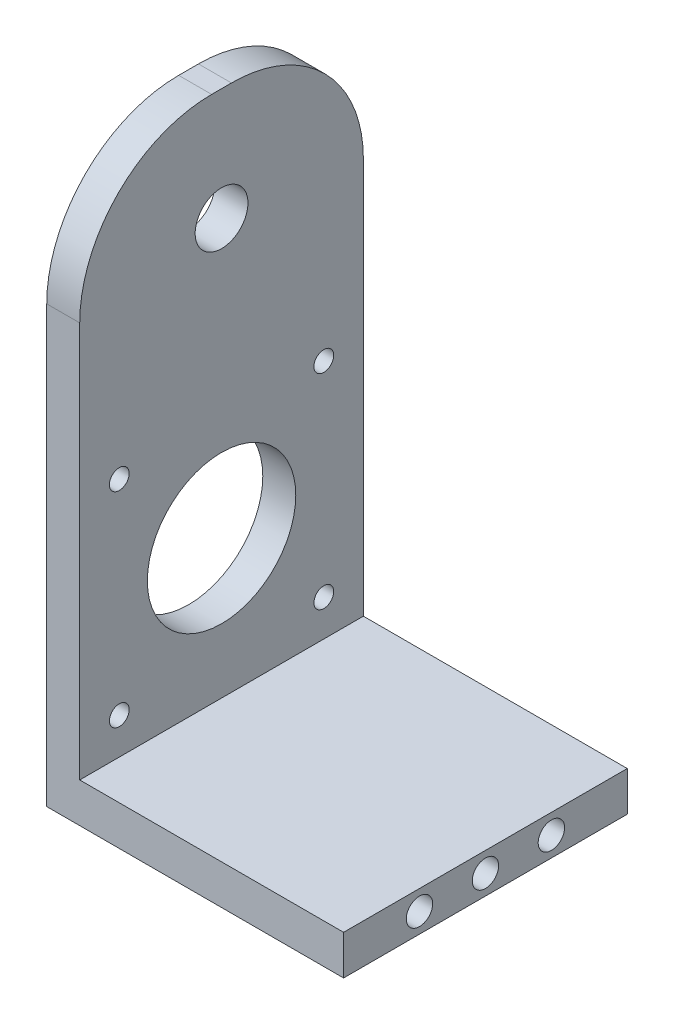
ISO-10303-21;
HEADER;
FILE_DESCRIPTION(('STEP AP214'),'2;1');
FILE_NAME('part.step','',(''),(''),'','','');
FILE_SCHEMA(('AUTOMOTIVE_DESIGN { 1 0 10303 214 1 1 1 1 }'));
ENDSEC;
DATA;
#1=APPLICATION_CONTEXT('core data for automotive mechanical design processes');
#2=APPLICATION_PROTOCOL_DEFINITION('international standard','automotive_design',2000,#1);
#3=PRODUCT_CONTEXT('',#1,'mechanical');
#4=PRODUCT('Part','Part','',(#3));
#5=PRODUCT_RELATED_PRODUCT_CATEGORY('part','',(#4));
#6=PRODUCT_DEFINITION_FORMATION('','',#4);
#7=PRODUCT_DEFINITION_CONTEXT('part definition',#1,'design');
#8=PRODUCT_DEFINITION('design','',#6,#7);
#9=PRODUCT_DEFINITION_SHAPE('','',#8);
#10=(LENGTH_UNIT() NAMED_UNIT(*) SI_UNIT(.MILLI.,.METRE.));
#11=(NAMED_UNIT(*) PLANE_ANGLE_UNIT() SI_UNIT($,.RADIAN.));
#12=(NAMED_UNIT(*) SI_UNIT($,.STERADIAN.) SOLID_ANGLE_UNIT());
#13=UNCERTAINTY_MEASURE_WITH_UNIT(LENGTH_MEASURE(1.E-05),#10,'distance_accuracy_value','');
#14=(GEOMETRIC_REPRESENTATION_CONTEXT(3) GLOBAL_UNCERTAINTY_ASSIGNED_CONTEXT((#13)) GLOBAL_UNIT_ASSIGNED_CONTEXT((#10,
#11,#12)) REPRESENTATION_CONTEXT('',''));
#15=CARTESIAN_POINT('',(0.,0.,0.));
#16=DIRECTION('',(0.,0.,1.));
#17=DIRECTION('',(1.,0.,0.));
#18=AXIS2_PLACEMENT_3D('',#15,#16,#17);
#19=CARTESIAN_POINT('',(-22.5,6.,21.5));
#20=DIRECTION('',(1.,0.,0.));
#21=DIRECTION('',(0.,0.,-1.));
#22=AXIS2_PLACEMENT_3D('',#19,#20,#21);
#23=PLANE('',#22);
#24=CARTESIAN_POINT('',(-22.5,69.,0.));
#25=DIRECTION('',(1.,0.,0.));
#26=DIRECTION('',(0.,0.,-1.));
#27=AXIS2_PLACEMENT_3D('',#24,#25,#26);
#28=CIRCLE('',#27,4.);
#29=CARTESIAN_POINT('',(-22.5,69.,-4.));
#30=VERTEX_POINT('',#29);
#31=EDGE_CURVE('E286',#30,#30,#28,.F.);
#32=ORIENTED_EDGE('',*,*,#31,.F.);
#33=EDGE_LOOP('',(#32));
#34=FACE_BOUND('',#33,.T.);
#35=CARTESIAN_POINT('',(-22.5,11.5000000000002,15.4999999999993));
#36=DIRECTION('',(1.,0.,0.));
#37=DIRECTION('',(0.,0.,-1.));
#38=AXIS2_PLACEMENT_3D('',#35,#36,#37);
#39=CIRCLE('',#38,1.5);
#40=CARTESIAN_POINT('',(-22.5,11.5000000000002,13.9999999999993));
#41=VERTEX_POINT('',#40);
#42=EDGE_CURVE('E306',#41,#41,#39,.F.);
#43=ORIENTED_EDGE('',*,*,#42,.F.);
#44=EDGE_LOOP('',(#43));
#45=FACE_BOUND('',#44,.T.);
#46=CARTESIAN_POINT('',(-22.5,11.5000000000008,-15.5000000000008));
#47=DIRECTION('',(1.,0.,0.));
#48=DIRECTION('',(0.,0.,-1.));
#49=AXIS2_PLACEMENT_3D('',#46,#47,#48);
#50=CIRCLE('',#49,1.5);
#51=CARTESIAN_POINT('',(-22.5,11.5000000000008,-17.0000000000008));
#52=VERTEX_POINT('',#51);
#53=EDGE_CURVE('E300',#52,#52,#50,.F.);
#54=ORIENTED_EDGE('',*,*,#53,.F.);
#55=EDGE_LOOP('',(#54));
#56=FACE_BOUND('',#55,.T.);
#57=CARTESIAN_POINT('',(-22.5,42.5000000000008,-15.5000000000001));
#58=DIRECTION('',(1.,0.,0.));
#59=DIRECTION('',(0.,0.,-1.));
#60=AXIS2_PLACEMENT_3D('',#57,#58,#59);
#61=CIRCLE('',#60,1.5);
#62=CARTESIAN_POINT('',(-22.5,42.5000000000008,-17.));
#63=VERTEX_POINT('',#62);
#64=EDGE_CURVE('E294',#63,#63,#61,.F.);
#65=ORIENTED_EDGE('',*,*,#64,.F.);
#66=EDGE_LOOP('',(#65));
#67=FACE_BOUND('',#66,.T.);
#68=CARTESIAN_POINT('',(-22.5,42.5,15.5));
#69=DIRECTION('',(1.,0.,0.));
#70=DIRECTION('',(0.,0.,-1.));
#71=AXIS2_PLACEMENT_3D('',#68,#69,#70);
#72=CIRCLE('',#71,1.5);
#73=CARTESIAN_POINT('',(-22.5,42.5,14.));
#74=VERTEX_POINT('',#73);
#75=EDGE_CURVE('E293',#74,#74,#72,.F.);
#76=ORIENTED_EDGE('',*,*,#75,.F.);
#77=EDGE_LOOP('',(#76));
#78=FACE_BOUND('',#77,.T.);
#79=CARTESIAN_POINT('',(-22.5,27.,0.));
#80=DIRECTION('',(1.,0.,0.));
#81=DIRECTION('',(0.,0.,-1.));
#82=AXIS2_PLACEMENT_3D('',#79,#80,#81);
#83=CIRCLE('',#82,11.25);
#84=CARTESIAN_POINT('',(-22.5,27.,-11.25));
#85=VERTEX_POINT('',#84);
#86=EDGE_CURVE('E125',#85,#85,#83,.F.);
#87=ORIENTED_EDGE('',*,*,#86,.F.);
#88=EDGE_LOOP('',(#87));
#89=FACE_BOUND('',#88,.T.);
#90=DIRECTION('',(0.,-1.,0.));
#91=VECTOR('',#90,1.);
#92=CARTESIAN_POINT('',(-22.5,6.,21.5));
#93=LINE('',#92,#91);
#94=CARTESIAN_POINT('',(-22.5,66.,21.5));
#95=VERTEX_POINT('',#94);
#96=CARTESIAN_POINT('',(-22.5,0.,21.5));
#97=VERTEX_POINT('',#96);
#98=EDGE_CURVE('E154',#95,#97,#93,.T.);
#99=ORIENTED_EDGE('',*,*,#98,.F.);
#100=CARTESIAN_POINT('',(-22.5,66.,1.5));
#101=DIRECTION('',(1.,0.,0.));
#102=DIRECTION('',(0.,0.,-1.));
#103=AXIS2_PLACEMENT_3D('',#100,#101,#102);
#104=CIRCLE('',#103,20.);
#105=CARTESIAN_POINT('',(-22.5,86.,1.5));
#106=VERTEX_POINT('',#105);
#107=EDGE_CURVE('E43',#95,#106,#104,.F.);
#108=ORIENTED_EDGE('',*,*,#107,.T.);
#109=DIRECTION('',(0.,0.,1.));
#110=VECTOR('',#109,1.);
#111=CARTESIAN_POINT('',(-22.5,86.,-21.5));
#112=LINE('',#111,#110);
#113=CARTESIAN_POINT('',(-22.5,86.,-1.49999999999999));
#114=VERTEX_POINT('',#113);
#115=EDGE_CURVE('E124',#114,#106,#112,.T.);
#116=ORIENTED_EDGE('',*,*,#115,.F.);
#117=CARTESIAN_POINT('',(-22.5,66.,-1.49999999999999));
#118=DIRECTION('',(1.,0.,0.));
#119=DIRECTION('',(0.,0.,-1.));
#120=AXIS2_PLACEMENT_3D('',#117,#118,#119);
#121=CIRCLE('',#120,20.);
#122=CARTESIAN_POINT('',(-22.5,66.,-21.5));
#123=VERTEX_POINT('',#122);
#124=EDGE_CURVE('E50',#114,#123,#121,.F.);
#125=ORIENTED_EDGE('',*,*,#124,.T.);
#126=DIRECTION('',(0.,-1.,0.));
#127=VECTOR('',#126,1.);
#128=CARTESIAN_POINT('',(-22.5,6.,-21.5));
#129=LINE('',#128,#127);
#130=CARTESIAN_POINT('',(-22.5,0.,-21.5));
#131=VERTEX_POINT('',#130);
#132=EDGE_CURVE('E120',#123,#131,#129,.T.);
#133=ORIENTED_EDGE('',*,*,#132,.T.);
#134=DIRECTION('',(0.,0.,1.));
#135=VECTOR('',#134,1.);
#136=CARTESIAN_POINT('',(-22.5,0.,21.5));
#137=LINE('',#136,#135);
#138=EDGE_CURVE('E135',#131,#97,#137,.T.);
#139=ORIENTED_EDGE('',*,*,#138,.T.);
#140=EDGE_LOOP('',(#99,#108,#116,#125,#133,#139));
#141=FACE_BOUND('',#140,.T.);
#142=ADVANCED_FACE('F35',(#34,#45,#56,#67,#78,#89,#141),#23,.F.);
#143=CARTESIAN_POINT('',(22.5,6.,21.5));
#144=DIRECTION('',(0.,0.,-1.));
#145=DIRECTION('',(-1.,0.,0.));
#146=AXIS2_PLACEMENT_3D('',#143,#144,#145);
#147=PLANE('',#146);
#148=DIRECTION('',(0.,-1.,0.));
#149=VECTOR('',#148,1.);
#150=CARTESIAN_POINT('',(-17.5,86.,21.5));
#151=LINE('',#150,#149);
#152=CARTESIAN_POINT('',(-17.5,66.,21.5));
#153=VERTEX_POINT('',#152);
#154=CARTESIAN_POINT('',(-17.5,6.,21.5));
#155=VERTEX_POINT('',#154);
#156=EDGE_CURVE('E109',#153,#155,#151,.T.);
#157=ORIENTED_EDGE('',*,*,#156,.F.);
#158=DIRECTION('',(1.,0.,0.));
#159=VECTOR('',#158,1.);
#160=CARTESIAN_POINT('',(22.5,66.,21.5));
#161=LINE('',#160,#159);
#162=EDGE_CURVE('E58',#153,#95,#161,.F.);
#163=ORIENTED_EDGE('',*,*,#162,.T.);
#164=ORIENTED_EDGE('',*,*,#98,.T.);
#165=DIRECTION('',(1.,0.,0.));
#166=VECTOR('',#165,1.);
#167=CARTESIAN_POINT('',(22.5,0.,21.5));
#168=LINE('',#167,#166);
#169=CARTESIAN_POINT('',(22.5,0.,21.5));
#170=VERTEX_POINT('',#169);
#171=EDGE_CURVE('E142',#97,#170,#168,.T.);
#172=ORIENTED_EDGE('',*,*,#171,.T.);
#173=DIRECTION('',(0.,-1.,0.));
#174=VECTOR('',#173,1.);
#175=CARTESIAN_POINT('',(22.5,6.,21.5));
#176=LINE('',#175,#174);
#177=CARTESIAN_POINT('',(22.5,6.,21.5));
#178=VERTEX_POINT('',#177);
#179=EDGE_CURVE('E151',#178,#170,#176,.T.);
#180=ORIENTED_EDGE('',*,*,#179,.F.);
#181=DIRECTION('',(1.,0.,0.));
#182=VECTOR('',#181,1.);
#183=CARTESIAN_POINT('',(22.5,6.,21.5));
#184=LINE('',#183,#182);
#185=EDGE_CURVE('E136',#155,#178,#184,.T.);
#186=ORIENTED_EDGE('',*,*,#185,.F.);
#187=EDGE_LOOP('',(#157,#163,#164,#172,#180,#186));
#188=FACE_BOUND('',#187,.T.);
#189=ADVANCED_FACE('F175',(#188),#147,.F.);
#190=CARTESIAN_POINT('',(22.5,6.,21.5));
#191=DIRECTION('',(-1.,0.,0.));
#192=DIRECTION('',(0.,0.,1.));
#193=AXIS2_PLACEMENT_3D('',#190,#191,#192);
#194=PLANE('',#193);
#195=CARTESIAN_POINT('',(22.5,2.99999999999993,10.));
#196=DIRECTION('',(1.,0.,0.));
#197=DIRECTION('',(0.,0.,-1.));
#198=AXIS2_PLACEMENT_3D('',#195,#196,#197);
#199=CIRCLE('',#198,2.);
#200=CARTESIAN_POINT('',(22.5,2.99999999999993,8.));
#201=VERTEX_POINT('',#200);
#202=EDGE_CURVE('E278',#201,#201,#199,.T.);
#203=ORIENTED_EDGE('',*,*,#202,.F.);
#204=EDGE_LOOP('',(#203));
#205=FACE_BOUND('',#204,.T.);
#206=CARTESIAN_POINT('',(22.5,3.,-10.));
#207=DIRECTION('',(1.,0.,0.));
#208=DIRECTION('',(0.,0.,-1.));
#209=AXIS2_PLACEMENT_3D('',#206,#207,#208);
#210=CIRCLE('',#209,2.);
#211=CARTESIAN_POINT('',(22.5,3.,-12.));
#212=VERTEX_POINT('',#211);
#213=EDGE_CURVE('E267',#212,#212,#210,.T.);
#214=ORIENTED_EDGE('',*,*,#213,.F.);
#215=EDGE_LOOP('',(#214));
#216=FACE_BOUND('',#215,.T.);
#217=CARTESIAN_POINT('',(22.5,3.,0.));
#218=DIRECTION('',(1.,0.,0.));
#219=DIRECTION('',(0.,0.,-1.));
#220=AXIS2_PLACEMENT_3D('',#217,#218,#219);
#221=CIRCLE('',#220,2.);
#222=CARTESIAN_POINT('',(22.5,3.,-2.));
#223=VERTEX_POINT('',#222);
#224=EDGE_CURVE('E266',#223,#223,#221,.T.);
#225=ORIENTED_EDGE('',*,*,#224,.F.);
#226=EDGE_LOOP('',(#225));
#227=FACE_BOUND('',#226,.T.);
#228=DIRECTION('',(0.,0.,-1.));
#229=VECTOR('',#228,1.);
#230=CARTESIAN_POINT('',(22.5,0.,21.5));
#231=LINE('',#230,#229);
#232=CARTESIAN_POINT('',(22.5,0.,-21.5));
#233=VERTEX_POINT('',#232);
#234=EDGE_CURVE('E144',#170,#233,#231,.T.);
#235=ORIENTED_EDGE('',*,*,#234,.T.);
#236=DIRECTION('',(0.,-1.,0.));
#237=VECTOR('',#236,1.);
#238=CARTESIAN_POINT('',(22.5,6.,-21.5));
#239=LINE('',#238,#237);
#240=CARTESIAN_POINT('',(22.5,6.,-21.5));
#241=VERTEX_POINT('',#240);
#242=EDGE_CURVE('E149',#241,#233,#239,.T.);
#243=ORIENTED_EDGE('',*,*,#242,.F.);
#244=DIRECTION('',(0.,0.,-1.));
#245=VECTOR('',#244,1.);
#246=CARTESIAN_POINT('',(22.5,6.,21.5));
#247=LINE('',#246,#245);
#248=EDGE_CURVE('E118',#178,#241,#247,.T.);
#249=ORIENTED_EDGE('',*,*,#248,.F.);
#250=ORIENTED_EDGE('',*,*,#179,.T.);
#251=EDGE_LOOP('',(#235,#243,#249,#250));
#252=FACE_BOUND('',#251,.T.);
#253=ADVANCED_FACE('F180',(#205,#216,#227,#252),#194,.F.);
#254=CARTESIAN_POINT('',(22.5,6.,-21.5));
#255=DIRECTION('',(0.,0.,1.));
#256=DIRECTION('',(1.,0.,0.));
#257=AXIS2_PLACEMENT_3D('',#254,#255,#256);
#258=PLANE('',#257);
#259=ORIENTED_EDGE('',*,*,#132,.F.);
#260=DIRECTION('',(-1.,0.,0.));
#261=VECTOR('',#260,1.);
#262=CARTESIAN_POINT('',(22.5,66.,-21.5));
#263=LINE('',#262,#261);
#264=CARTESIAN_POINT('',(-17.5,66.,-21.5));
#265=VERTEX_POINT('',#264);
#266=EDGE_CURVE('E11',#123,#265,#263,.F.);
#267=ORIENTED_EDGE('',*,*,#266,.T.);
#268=DIRECTION('',(0.,-1.,0.));
#269=VECTOR('',#268,1.);
#270=CARTESIAN_POINT('',(-17.5,86.,-21.5));
#271=LINE('',#270,#269);
#272=CARTESIAN_POINT('',(-17.5,6.,-21.5));
#273=VERTEX_POINT('',#272);
#274=EDGE_CURVE('E100',#265,#273,#271,.T.);
#275=ORIENTED_EDGE('',*,*,#274,.T.);
#276=DIRECTION('',(-1.,0.,0.));
#277=VECTOR('',#276,1.);
#278=CARTESIAN_POINT('',(22.5,6.,-21.5));
#279=LINE('',#278,#277);
#280=EDGE_CURVE('E104',#241,#273,#279,.T.);
#281=ORIENTED_EDGE('',*,*,#280,.F.);
#282=ORIENTED_EDGE('',*,*,#242,.T.);
#283=DIRECTION('',(-1.,0.,0.));
#284=VECTOR('',#283,1.);
#285=CARTESIAN_POINT('',(22.5,0.,-21.5));
#286=LINE('',#285,#284);
#287=EDGE_CURVE('E138',#233,#131,#286,.T.);
#288=ORIENTED_EDGE('',*,*,#287,.T.);
#289=EDGE_LOOP('',(#259,#267,#275,#281,#282,#288));
#290=FACE_BOUND('',#289,.T.);
#291=ADVANCED_FACE('F102',(#290),#258,.F.);
#292=CARTESIAN_POINT('',(0.,6.,0.));
#293=DIRECTION('',(0.,1.,0.));
#294=DIRECTION('',(0.,0.,1.));
#295=AXIS2_PLACEMENT_3D('',#292,#293,#294);
#296=PLANE('',#295);
#297=DIRECTION('',(0.,0.,-1.));
#298=VECTOR('',#297,1.);
#299=CARTESIAN_POINT('',(-17.5,6.,-21.5));
#300=LINE('',#299,#298);
#301=EDGE_CURVE('E115',#155,#273,#300,.T.);
#302=ORIENTED_EDGE('',*,*,#301,.F.);
#303=ORIENTED_EDGE('',*,*,#185,.T.);
#304=ORIENTED_EDGE('',*,*,#248,.T.);
#305=ORIENTED_EDGE('',*,*,#280,.T.);
#306=EDGE_LOOP('',(#302,#303,#304,#305));
#307=FACE_BOUND('',#306,.T.);
#308=ADVANCED_FACE('F114',(#307),#296,.T.);
#309=CARTESIAN_POINT('',(0.,0.,0.));
#310=DIRECTION('',(0.,1.,0.));
#311=DIRECTION('',(0.,0.,1.));
#312=AXIS2_PLACEMENT_3D('',#309,#310,#311);
#313=PLANE('',#312);
#314=ORIENTED_EDGE('',*,*,#138,.F.);
#315=ORIENTED_EDGE('',*,*,#287,.F.);
#316=ORIENTED_EDGE('',*,*,#234,.F.);
#317=ORIENTED_EDGE('',*,*,#171,.F.);
#318=EDGE_LOOP('',(#314,#315,#316,#317));
#319=FACE_BOUND('',#318,.T.);
#320=ADVANCED_FACE('F184',(#319),#313,.F.);
#321=CARTESIAN_POINT('',(-17.5,86.,-21.5));
#322=DIRECTION('',(-1.,0.,0.));
#323=DIRECTION('',(0.,0.,1.));
#324=AXIS2_PLACEMENT_3D('',#321,#322,#323);
#325=PLANE('',#324);
#326=CARTESIAN_POINT('',(-17.5,69.,0.));
#327=DIRECTION('',(1.,0.,0.));
#328=DIRECTION('',(0.,0.,-1.));
#329=AXIS2_PLACEMENT_3D('',#326,#327,#328);
#330=CIRCLE('',#329,4.);
#331=CARTESIAN_POINT('',(-17.5,69.,-4.));
#332=VERTEX_POINT('',#331);
#333=EDGE_CURVE('E282',#332,#332,#330,.T.);
#334=ORIENTED_EDGE('',*,*,#333,.F.);
#335=EDGE_LOOP('',(#334));
#336=FACE_BOUND('',#335,.T.);
#337=CARTESIAN_POINT('',(-17.5,11.5000000000002,15.4999999999993));
#338=DIRECTION('',(1.,0.,0.));
#339=DIRECTION('',(0.,0.,-1.));
#340=AXIS2_PLACEMENT_3D('',#337,#338,#339);
#341=CIRCLE('',#340,1.5);
#342=CARTESIAN_POINT('',(-17.5,11.5000000000002,13.9999999999993));
#343=VERTEX_POINT('',#342);
#344=EDGE_CURVE('E289',#343,#343,#341,.T.);
#345=ORIENTED_EDGE('',*,*,#344,.F.);
#346=EDGE_LOOP('',(#345));
#347=FACE_BOUND('',#346,.T.);
#348=CARTESIAN_POINT('',(-17.5,11.5000000000008,-15.5000000000008));
#349=DIRECTION('',(1.,0.,0.));
#350=DIRECTION('',(0.,0.,-1.));
#351=AXIS2_PLACEMENT_3D('',#348,#349,#350);
#352=CIRCLE('',#351,1.5);
#353=CARTESIAN_POINT('',(-17.5,11.5000000000008,-17.0000000000008));
#354=VERTEX_POINT('',#353);
#355=EDGE_CURVE('E303',#354,#354,#352,.T.);
#356=ORIENTED_EDGE('',*,*,#355,.F.);
#357=EDGE_LOOP('',(#356));
#358=FACE_BOUND('',#357,.T.);
#359=CARTESIAN_POINT('',(-17.5,42.5000000000008,-15.5000000000001));
#360=DIRECTION('',(1.,0.,0.));
#361=DIRECTION('',(0.,0.,-1.));
#362=AXIS2_PLACEMENT_3D('',#359,#360,#361);
#363=CIRCLE('',#362,1.5);
#364=CARTESIAN_POINT('',(-17.5,42.5000000000008,-17.));
#365=VERTEX_POINT('',#364);
#366=EDGE_CURVE('E297',#365,#365,#363,.T.);
#367=ORIENTED_EDGE('',*,*,#366,.F.);
#368=EDGE_LOOP('',(#367));
#369=FACE_BOUND('',#368,.T.);
#370=CARTESIAN_POINT('',(-17.5,42.5,15.5));
#371=DIRECTION('',(1.,0.,0.));
#372=DIRECTION('',(0.,0.,-1.));
#373=AXIS2_PLACEMENT_3D('',#370,#371,#372);
#374=CIRCLE('',#373,1.5);
#375=CARTESIAN_POINT('',(-17.5,42.5,14.));
#376=VERTEX_POINT('',#375);
#377=EDGE_CURVE('E290',#376,#376,#374,.T.);
#378=ORIENTED_EDGE('',*,*,#377,.F.);
#379=EDGE_LOOP('',(#378));
#380=FACE_BOUND('',#379,.T.);
#381=CARTESIAN_POINT('',(-17.5,27.,0.));
#382=DIRECTION('',(1.,0.,0.));
#383=DIRECTION('',(0.,0.,-1.));
#384=AXIS2_PLACEMENT_3D('',#381,#382,#383);
#385=CIRCLE('',#384,11.25);
#386=CARTESIAN_POINT('',(-17.5,27.,-11.25));
#387=VERTEX_POINT('',#386);
#388=EDGE_CURVE('E130',#387,#387,#385,.T.);
#389=ORIENTED_EDGE('',*,*,#388,.F.);
#390=EDGE_LOOP('',(#389));
#391=FACE_BOUND('',#390,.T.);
#392=DIRECTION('',(0.,0.,-1.));
#393=VECTOR('',#392,1.);
#394=CARTESIAN_POINT('',(-17.5,86.,-21.5));
#395=LINE('',#394,#393);
#396=CARTESIAN_POINT('',(-17.5,86.,1.5));
#397=VERTEX_POINT('',#396);
#398=CARTESIAN_POINT('',(-17.5,86.,-1.49999999999999));
#399=VERTEX_POINT('',#398);
#400=EDGE_CURVE('E110',#397,#399,#395,.T.);
#401=ORIENTED_EDGE('',*,*,#400,.F.);
#402=CARTESIAN_POINT('',(-17.5,66.,1.5));
#403=DIRECTION('',(-1.,0.,0.));
#404=DIRECTION('',(0.,0.,1.));
#405=AXIS2_PLACEMENT_3D('',#402,#403,#404);
#406=CIRCLE('',#405,20.);
#407=EDGE_CURVE('E164',#397,#153,#406,.F.);
#408=ORIENTED_EDGE('',*,*,#407,.T.);
#409=ORIENTED_EDGE('',*,*,#156,.T.);
#410=ORIENTED_EDGE('',*,*,#301,.T.);
#411=ORIENTED_EDGE('',*,*,#274,.F.);
#412=CARTESIAN_POINT('',(-17.5,66.,-1.49999999999999));
#413=DIRECTION('',(-1.,0.,0.));
#414=DIRECTION('',(0.,0.,1.));
#415=AXIS2_PLACEMENT_3D('',#412,#413,#414);
#416=CIRCLE('',#415,20.);
#417=EDGE_CURVE('E162',#265,#399,#416,.F.);
#418=ORIENTED_EDGE('',*,*,#417,.T.);
#419=EDGE_LOOP('',(#401,#408,#409,#410,#411,#418));
#420=FACE_BOUND('',#419,.T.);
#421=ADVANCED_FACE('F123',(#336,#347,#358,#369,#380,#391,#420),#325,.F.);
#422=CARTESIAN_POINT('',(0.,86.,0.));
#423=DIRECTION('',(0.,-1.,0.));
#424=DIRECTION('',(0.,0.,-1.));
#425=AXIS2_PLACEMENT_3D('',#422,#423,#424);
#426=PLANE('',#425);
#427=ORIENTED_EDGE('',*,*,#115,.T.);
#428=DIRECTION('',(1.,0.,0.));
#429=VECTOR('',#428,1.);
#430=CARTESIAN_POINT('',(0.,86.,1.5));
#431=LINE('',#430,#429);
#432=EDGE_CURVE('E159',#106,#397,#431,.T.);
#433=ORIENTED_EDGE('',*,*,#432,.T.);
#434=ORIENTED_EDGE('',*,*,#400,.T.);
#435=DIRECTION('',(-1.,0.,0.));
#436=VECTOR('',#435,1.);
#437=CARTESIAN_POINT('',(0.,86.,-1.49999999999999));
#438=LINE('',#437,#436);
#439=EDGE_CURVE('E156',#399,#114,#438,.T.);
#440=ORIENTED_EDGE('',*,*,#439,.T.);
#441=EDGE_LOOP('',(#427,#433,#434,#440));
#442=FACE_BOUND('',#441,.T.);
#443=ADVANCED_FACE('F171',(#442),#426,.F.);
#444=CARTESIAN_POINT('',(-22.501,27.,0.));
#445=DIRECTION('',(1.,0.,0.));
#446=DIRECTION('',(0.,0.,-1.));
#447=AXIS2_PLACEMENT_3D('',#444,#445,#446);
#448=CYLINDRICAL_SURFACE('',#447,11.25);
#449=ORIENTED_EDGE('',*,*,#388,.T.);
#450=EDGE_LOOP('',(#449));
#451=FACE_BOUND('',#450,.T.);
#452=ORIENTED_EDGE('',*,*,#86,.T.);
#453=EDGE_LOOP('',(#452));
#454=FACE_BOUND('',#453,.T.);
#455=ADVANCED_FACE('F220',(#451,#454),#448,.F.);
#456=CARTESIAN_POINT('',(-22.501,42.5,15.5));
#457=DIRECTION('',(1.,0.,0.));
#458=DIRECTION('',(0.,0.,-1.));
#459=AXIS2_PLACEMENT_3D('',#456,#457,#458);
#460=CYLINDRICAL_SURFACE('',#459,1.5);
#461=ORIENTED_EDGE('',*,*,#377,.T.);
#462=EDGE_LOOP('',(#461));
#463=FACE_BOUND('',#462,.T.);
#464=ORIENTED_EDGE('',*,*,#75,.T.);
#465=EDGE_LOOP('',(#464));
#466=FACE_BOUND('',#465,.T.);
#467=ADVANCED_FACE('F223',(#463,#466),#460,.F.);
#468=CARTESIAN_POINT('',(-22.501,42.5000000000008,-15.5000000000001));
#469=DIRECTION('',(1.,0.,0.));
#470=DIRECTION('',(0.,0.,-1.));
#471=AXIS2_PLACEMENT_3D('',#468,#469,#470);
#472=CYLINDRICAL_SURFACE('',#471,1.5);
#473=ORIENTED_EDGE('',*,*,#366,.T.);
#474=EDGE_LOOP('',(#473));
#475=FACE_BOUND('',#474,.T.);
#476=ORIENTED_EDGE('',*,*,#64,.T.);
#477=EDGE_LOOP('',(#476));
#478=FACE_BOUND('',#477,.T.);
#479=ADVANCED_FACE('F232',(#475,#478),#472,.F.);
#480=CARTESIAN_POINT('',(-22.501,11.5000000000008,-15.5000000000008));
#481=DIRECTION('',(1.,0.,0.));
#482=DIRECTION('',(0.,0.,-1.));
#483=AXIS2_PLACEMENT_3D('',#480,#481,#482);
#484=CYLINDRICAL_SURFACE('',#483,1.5);
#485=ORIENTED_EDGE('',*,*,#355,.T.);
#486=EDGE_LOOP('',(#485));
#487=FACE_BOUND('',#486,.T.);
#488=ORIENTED_EDGE('',*,*,#53,.T.);
#489=EDGE_LOOP('',(#488));
#490=FACE_BOUND('',#489,.T.);
#491=ADVANCED_FACE('F228',(#487,#490),#484,.F.);
#492=CARTESIAN_POINT('',(-22.501,11.5000000000002,15.4999999999993));
#493=DIRECTION('',(1.,0.,0.));
#494=DIRECTION('',(0.,0.,-1.));
#495=AXIS2_PLACEMENT_3D('',#492,#493,#494);
#496=CYLINDRICAL_SURFACE('',#495,1.5);
#497=ORIENTED_EDGE('',*,*,#344,.T.);
#498=EDGE_LOOP('',(#497));
#499=FACE_BOUND('',#498,.T.);
#500=ORIENTED_EDGE('',*,*,#42,.T.);
#501=EDGE_LOOP('',(#500));
#502=FACE_BOUND('',#501,.T.);
#503=ADVANCED_FACE('F225',(#499,#502),#496,.F.);
#504=CARTESIAN_POINT('',(-22.501,69.,0.));
#505=DIRECTION('',(1.,0.,0.));
#506=DIRECTION('',(0.,0.,-1.));
#507=AXIS2_PLACEMENT_3D('',#504,#505,#506);
#508=CYLINDRICAL_SURFACE('',#507,4.);
#509=ORIENTED_EDGE('',*,*,#333,.T.);
#510=EDGE_LOOP('',(#509));
#511=FACE_BOUND('',#510,.T.);
#512=ORIENTED_EDGE('',*,*,#31,.T.);
#513=EDGE_LOOP('',(#512));
#514=FACE_BOUND('',#513,.T.);
#515=ADVANCED_FACE('F195',(#511,#514),#508,.F.);
#516=CARTESIAN_POINT('',(0.,66.,1.5));
#517=DIRECTION('',(1.,0.,0.));
#518=DIRECTION('',(0.,0.,-1.));
#519=AXIS2_PLACEMENT_3D('',#516,#517,#518);
#520=CYLINDRICAL_SURFACE('',#519,20.);
#521=ORIENTED_EDGE('',*,*,#107,.F.);
#522=ORIENTED_EDGE('',*,*,#162,.F.);
#523=ORIENTED_EDGE('',*,*,#407,.F.);
#524=ORIENTED_EDGE('',*,*,#432,.F.);
#525=EDGE_LOOP('',(#521,#522,#523,#524));
#526=FACE_BOUND('',#525,.T.);
#527=ADVANCED_FACE('F174',(#526),#520,.T.);
#528=CARTESIAN_POINT('',(0.,66.,-1.49999999999999));
#529=DIRECTION('',(-1.,0.,0.));
#530=DIRECTION('',(0.,0.,1.));
#531=AXIS2_PLACEMENT_3D('',#528,#529,#530);
#532=CYLINDRICAL_SURFACE('',#531,20.);
#533=ORIENTED_EDGE('',*,*,#417,.F.);
#534=ORIENTED_EDGE('',*,*,#266,.F.);
#535=ORIENTED_EDGE('',*,*,#124,.F.);
#536=ORIENTED_EDGE('',*,*,#439,.F.);
#537=EDGE_LOOP('',(#533,#534,#535,#536));
#538=FACE_BOUND('',#537,.T.);
#539=ADVANCED_FACE('F37',(#538),#532,.T.);
#540=CARTESIAN_POINT('',(12.5,3.,0.));
#541=DIRECTION('',(1.,0.,0.));
#542=DIRECTION('',(0.,0.,-1.));
#543=AXIS2_PLACEMENT_3D('',#540,#541,#542);
#544=CYLINDRICAL_SURFACE('',#543,2.);
#545=CARTESIAN_POINT('',(12.5,3.,0.));
#546=DIRECTION('',(1.,0.,0.));
#547=DIRECTION('',(0.,0.,-1.));
#548=AXIS2_PLACEMENT_3D('',#545,#546,#547);
#549=CIRCLE('',#548,2.);
#550=CARTESIAN_POINT('',(12.5,3.,-2.));
#551=VERTEX_POINT('',#550);
#552=EDGE_CURVE('E270',#551,#551,#549,.T.);
#553=ORIENTED_EDGE('',*,*,#552,.F.);
#554=EDGE_LOOP('',(#553));
#555=FACE_BOUND('',#554,.T.);
#556=ORIENTED_EDGE('',*,*,#224,.T.);
#557=EDGE_LOOP('',(#556));
#558=FACE_BOUND('',#557,.T.);
#559=ADVANCED_FACE('F187',(#555,#558),#544,.F.);
#560=CARTESIAN_POINT('',(12.5,3.,0.));
#561=DIRECTION('',(1.,0.,0.));
#562=DIRECTION('',(0.,0.,-1.));
#563=AXIS2_PLACEMENT_3D('',#560,#561,#562);
#564=PLANE('',#563);
#565=ORIENTED_EDGE('',*,*,#552,.T.);
#566=EDGE_LOOP('',(#565));
#567=FACE_BOUND('',#566,.T.);
#568=ADVANCED_FACE('F192',(#567),#564,.T.);
#569=CARTESIAN_POINT('',(12.5,3.,-10.));
#570=DIRECTION('',(1.,0.,0.));
#571=DIRECTION('',(0.,0.,-1.));
#572=AXIS2_PLACEMENT_3D('',#569,#570,#571);
#573=CYLINDRICAL_SURFACE('',#572,2.);
#574=CARTESIAN_POINT('',(12.5,3.,-10.));
#575=DIRECTION('',(1.,0.,0.));
#576=DIRECTION('',(0.,0.,-1.));
#577=AXIS2_PLACEMENT_3D('',#574,#575,#576);
#578=CIRCLE('',#577,2.);
#579=CARTESIAN_POINT('',(12.5,3.,-12.));
#580=VERTEX_POINT('',#579);
#581=EDGE_CURVE('E265',#580,#580,#578,.T.);
#582=ORIENTED_EDGE('',*,*,#581,.F.);
#583=EDGE_LOOP('',(#582));
#584=FACE_BOUND('',#583,.T.);
#585=ORIENTED_EDGE('',*,*,#213,.T.);
#586=EDGE_LOOP('',(#585));
#587=FACE_BOUND('',#586,.T.);
#588=ADVANCED_FACE('F245',(#584,#587),#573,.F.);
#589=CARTESIAN_POINT('',(12.5,3.,-10.));
#590=DIRECTION('',(1.,0.,0.));
#591=DIRECTION('',(0.,0.,-1.));
#592=AXIS2_PLACEMENT_3D('',#589,#590,#591);
#593=PLANE('',#592);
#594=ORIENTED_EDGE('',*,*,#581,.T.);
#595=EDGE_LOOP('',(#594));
#596=FACE_BOUND('',#595,.T.);
#597=ADVANCED_FACE('F251',(#596),#593,.T.);
#598=CARTESIAN_POINT('',(12.5,2.99999999999993,10.));
#599=DIRECTION('',(1.,0.,0.));
#600=DIRECTION('',(0.,0.,-1.));
#601=AXIS2_PLACEMENT_3D('',#598,#599,#600);
#602=CYLINDRICAL_SURFACE('',#601,2.);
#603=CARTESIAN_POINT('',(12.5,2.99999999999993,10.));
#604=DIRECTION('',(1.,0.,0.));
#605=DIRECTION('',(0.,0.,-1.));
#606=AXIS2_PLACEMENT_3D('',#603,#604,#605);
#607=CIRCLE('',#606,2.);
#608=CARTESIAN_POINT('',(12.5,2.99999999999993,8.));
#609=VERTEX_POINT('',#608);
#610=EDGE_CURVE('E273',#609,#609,#607,.T.);
#611=ORIENTED_EDGE('',*,*,#610,.F.);
#612=EDGE_LOOP('',(#611));
#613=FACE_BOUND('',#612,.T.);
#614=ORIENTED_EDGE('',*,*,#202,.T.);
#615=EDGE_LOOP('',(#614));
#616=FACE_BOUND('',#615,.T.);
#617=ADVANCED_FACE('F247',(#613,#616),#602,.F.);
#618=CARTESIAN_POINT('',(12.5,2.99999999999993,10.));
#619=DIRECTION('',(1.,0.,0.));
#620=DIRECTION('',(0.,0.,-1.));
#621=AXIS2_PLACEMENT_3D('',#618,#619,#620);
#622=PLANE('',#621);
#623=ORIENTED_EDGE('',*,*,#610,.T.);
#624=EDGE_LOOP('',(#623));
#625=FACE_BOUND('',#624,.T.);
#626=ADVANCED_FACE('F250',(#625),#622,.T.);
#627=CLOSED_SHELL('',(#142,#189,#253,#291,#308,#320,#421,#443,#455,#467,#479,#491,#503,#515,
#527,#539,#559,#568,#588,#597,#617,#626));
#628=MANIFOLD_SOLID_BREP('B2',#627);
#629=ADVANCED_BREP_SHAPE_REPRESENTATION('',(#18,#628),#14);
#630=SHAPE_DEFINITION_REPRESENTATION(#9,#629);
ENDSEC;
END-ISO-10303-21;
